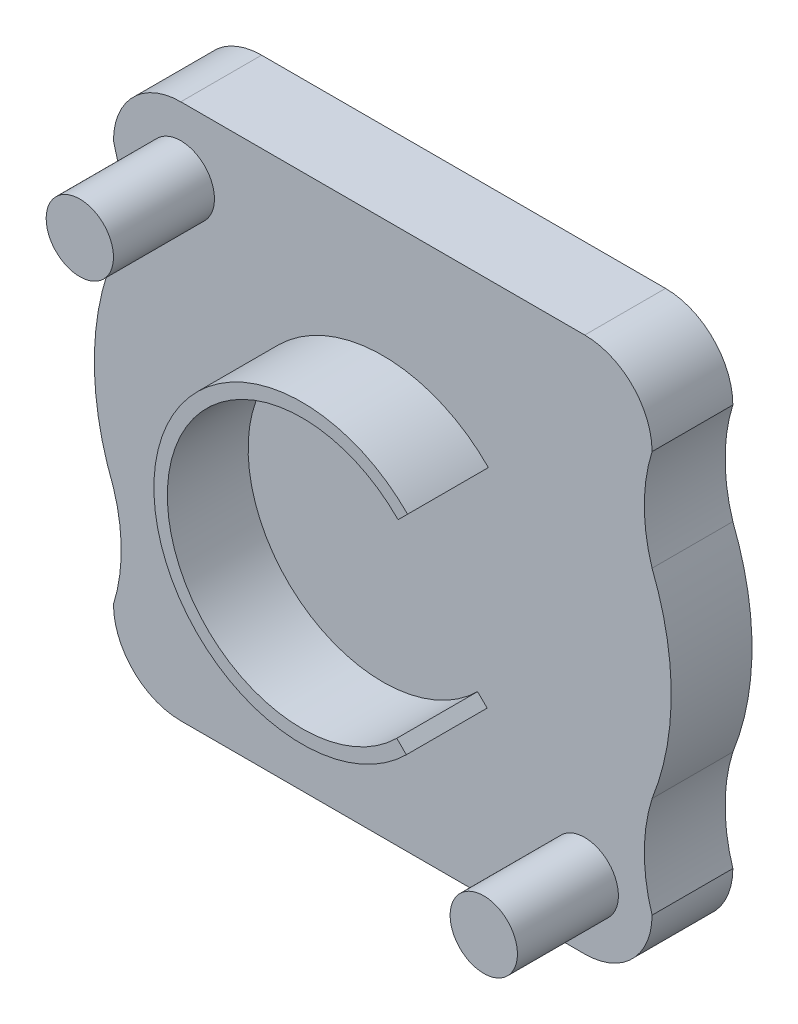
ISO-10303-21;
HEADER;
FILE_DESCRIPTION(('STEP AP214'),'2;1');
FILE_NAME('part.step','',(''),(''),'','','');
FILE_SCHEMA(('AUTOMOTIVE_DESIGN { 1 0 10303 214 1 1 1 1 }'));
ENDSEC;
DATA;
#1=APPLICATION_CONTEXT('core data for automotive mechanical design processes');
#2=APPLICATION_PROTOCOL_DEFINITION('international standard','automotive_design',2000,#1);
#3=PRODUCT_CONTEXT('',#1,'mechanical');
#4=PRODUCT('Part','Part','',(#3));
#5=PRODUCT_RELATED_PRODUCT_CATEGORY('part','',(#4));
#6=PRODUCT_DEFINITION_FORMATION('','',#4);
#7=PRODUCT_DEFINITION_CONTEXT('part definition',#1,'design');
#8=PRODUCT_DEFINITION('design','',#6,#7);
#9=PRODUCT_DEFINITION_SHAPE('','',#8);
#10=(LENGTH_UNIT() NAMED_UNIT(*) SI_UNIT(.MILLI.,.METRE.));
#11=(NAMED_UNIT(*) PLANE_ANGLE_UNIT() SI_UNIT($,.RADIAN.));
#12=(NAMED_UNIT(*) SI_UNIT($,.STERADIAN.) SOLID_ANGLE_UNIT());
#13=UNCERTAINTY_MEASURE_WITH_UNIT(LENGTH_MEASURE(1.E-05),#10,'distance_accuracy_value','');
#14=(GEOMETRIC_REPRESENTATION_CONTEXT(3) GLOBAL_UNCERTAINTY_ASSIGNED_CONTEXT((#13)) GLOBAL_UNIT_ASSIGNED_CONTEXT((#10,
#11,#12)) REPRESENTATION_CONTEXT('',''));
#15=CARTESIAN_POINT('',(0.,0.,0.));
#16=DIRECTION('',(0.,0.,1.));
#17=DIRECTION('',(1.,0.,0.));
#18=AXIS2_PLACEMENT_3D('',#15,#16,#17);
#19=CARTESIAN_POINT('',(16.2175139289976,5.62133263666804,0.));
#20=DIRECTION('',(0.,0.,1.));
#21=DIRECTION('',(1.,0.,0.));
#22=AXIS2_PLACEMENT_3D('',#19,#20,#21);
#23=PLANE('',#22);
#24=CARTESIAN_POINT('',(7.62,-7.62,0.));
#25=DIRECTION('',(0.,0.,1.));
#26=DIRECTION('',(1.,0.,0.));
#27=AXIS2_PLACEMENT_3D('',#24,#25,#26);
#28=CIRCLE('',#27,1.27);
#29=CARTESIAN_POINT('',(6.35,-7.62,0.));
#30=VERTEX_POINT('',#29);
#31=EDGE_CURVE('E295',#30,#30,#28,.T.);
#32=ORIENTED_EDGE('',*,*,#31,.F.);
#33=EDGE_LOOP('',(#32));
#34=FACE_BOUND('',#33,.T.);
#35=CARTESIAN_POINT('',(-7.62000000000001,7.52633263666802,0.));
#36=DIRECTION('',(0.,0.,1.));
#37=DIRECTION('',(1.,0.,0.));
#38=AXIS2_PLACEMENT_3D('',#35,#36,#37);
#39=CIRCLE('',#38,1.27);
#40=CARTESIAN_POINT('',(-8.89000000000001,7.52633263666802,0.));
#41=VERTEX_POINT('',#40);
#42=EDGE_CURVE('E294',#41,#41,#39,.T.);
#43=ORIENTED_EDGE('',*,*,#42,.F.);
#44=EDGE_LOOP('',(#43));
#45=FACE_BOUND('',#44,.T.);
#46=CARTESIAN_POINT('',(16.2175139289976,5.62133263666804,0.));
#47=DIRECTION('',(0.,0.,-1.));
#48=DIRECTION('',(1.,0.,0.));
#49=AXIS2_PLACEMENT_3D('',#46,#47,#48);
#50=CIRCLE('',#49,6.34999999999999);
#51=CARTESIAN_POINT('',(10.16,3.71633263666804,0.));
#52=VERTEX_POINT('',#51);
#53=CARTESIAN_POINT('',(10.16,7.52633263666802,0.));
#54=VERTEX_POINT('',#53);
#55=EDGE_CURVE('E183',#52,#54,#50,.T.);
#56=ORIENTED_EDGE('',*,*,#55,.T.);
#57=CARTESIAN_POINT('',(7.62,7.52633263666802,0.));
#58=DIRECTION('',(0.,0.,1.));
#59=DIRECTION('',(1.,0.,0.));
#60=AXIS2_PLACEMENT_3D('',#57,#58,#59);
#61=CIRCLE('',#60,2.54);
#62=CARTESIAN_POINT('',(7.62,10.066332636668,0.));
#63=VERTEX_POINT('',#62);
#64=EDGE_CURVE('E186',#54,#63,#61,.T.);
#65=ORIENTED_EDGE('',*,*,#64,.T.);
#66=DIRECTION('',(-1.,0.,0.));
#67=VECTOR('',#66,1.);
#68=CARTESIAN_POINT('',(-7.62000000000001,10.066332636668,0.));
#69=LINE('',#68,#67);
#70=CARTESIAN_POINT('',(-7.62000000000001,10.066332636668,0.));
#71=VERTEX_POINT('',#70);
#72=EDGE_CURVE('E190',#63,#71,#69,.T.);
#73=ORIENTED_EDGE('',*,*,#72,.T.);
#74=CARTESIAN_POINT('',(-7.62000000000001,7.52633263666802,0.));
#75=DIRECTION('',(0.,0.,1.));
#76=DIRECTION('',(-1.,0.,0.));
#77=AXIS2_PLACEMENT_3D('',#74,#75,#76);
#78=CIRCLE('',#77,2.54);
#79=CARTESIAN_POINT('',(-10.16,7.52633263666802,0.));
#80=VERTEX_POINT('',#79);
#81=EDGE_CURVE('E193',#71,#80,#78,.T.);
#82=ORIENTED_EDGE('',*,*,#81,.T.);
#83=CARTESIAN_POINT('',(-16.2175139289976,5.62133263666803,0.));
#84=DIRECTION('',(0.,0.,-1.));
#85=DIRECTION('',(-1.,0.,0.));
#86=AXIS2_PLACEMENT_3D('',#83,#84,#85);
#87=CIRCLE('',#86,6.35);
#88=CARTESIAN_POINT('',(-10.16,3.71633263666804,0.));
#89=VERTEX_POINT('',#88);
#90=EDGE_CURVE('E196',#80,#89,#87,.T.);
#91=ORIENTED_EDGE('',*,*,#90,.T.);
#92=CARTESIAN_POINT('',(-0.722617986933221,-0.0468336816659767,0.));
#93=DIRECTION('',(0.,0.,1.));
#94=DIRECTION('',(1.,0.,0.));
#95=AXIS2_PLACEMENT_3D('',#92,#93,#94);
#96=CIRCLE('',#95,10.16);
#97=CARTESIAN_POINT('',(-10.16,-3.81,0.));
#98=VERTEX_POINT('',#97);
#99=EDGE_CURVE('E199',#89,#98,#96,.T.);
#100=ORIENTED_EDGE('',*,*,#99,.T.);
#101=CARTESIAN_POINT('',(-16.2175139289976,-5.71499999999999,0.));
#102=DIRECTION('',(0.,0.,-1.));
#103=DIRECTION('',(1.,0.,0.));
#104=AXIS2_PLACEMENT_3D('',#101,#102,#103);
#105=CIRCLE('',#104,6.35);
#106=CARTESIAN_POINT('',(-10.16,-7.61999999999998,0.));
#107=VERTEX_POINT('',#106);
#108=EDGE_CURVE('E202',#98,#107,#105,.T.);
#109=ORIENTED_EDGE('',*,*,#108,.T.);
#110=CARTESIAN_POINT('',(-7.62,-7.62,0.));
#111=DIRECTION('',(0.,0.,1.));
#112=DIRECTION('',(-1.,0.,0.));
#113=AXIS2_PLACEMENT_3D('',#110,#111,#112);
#114=CIRCLE('',#113,2.54);
#115=CARTESIAN_POINT('',(-7.61999999999998,-10.16,0.));
#116=VERTEX_POINT('',#115);
#117=EDGE_CURVE('E205',#107,#116,#114,.T.);
#118=ORIENTED_EDGE('',*,*,#117,.T.);
#119=DIRECTION('',(1.,0.,0.));
#120=VECTOR('',#119,1.);
#121=CARTESIAN_POINT('',(0.,-10.16,0.));
#122=LINE('',#121,#120);
#123=CARTESIAN_POINT('',(7.61999999999998,-10.16,0.));
#124=VERTEX_POINT('',#123);
#125=EDGE_CURVE('E208',#116,#124,#122,.T.);
#126=ORIENTED_EDGE('',*,*,#125,.T.);
#127=CARTESIAN_POINT('',(7.62,-7.62,0.));
#128=DIRECTION('',(0.,0.,1.));
#129=DIRECTION('',(1.,0.,0.));
#130=AXIS2_PLACEMENT_3D('',#127,#128,#129);
#131=CIRCLE('',#130,2.54);
#132=CARTESIAN_POINT('',(10.16,-7.62,0.));
#133=VERTEX_POINT('',#132);
#134=EDGE_CURVE('E211',#124,#133,#131,.T.);
#135=ORIENTED_EDGE('',*,*,#134,.T.);
#136=CARTESIAN_POINT('',(16.2175139289976,-5.71499999999999,0.));
#137=DIRECTION('',(0.,0.,-1.));
#138=DIRECTION('',(-1.,0.,0.));
#139=AXIS2_PLACEMENT_3D('',#136,#137,#138);
#140=CIRCLE('',#139,6.35);
#141=CARTESIAN_POINT('',(10.16,-3.81,0.));
#142=VERTEX_POINT('',#141);
#143=EDGE_CURVE('E160',#133,#142,#140,.T.);
#144=ORIENTED_EDGE('',*,*,#143,.T.);
#145=CARTESIAN_POINT('',(0.72261798693322,-0.0468336816659767,0.));
#146=DIRECTION('',(0.,0.,1.));
#147=DIRECTION('',(-1.,0.,0.));
#148=AXIS2_PLACEMENT_3D('',#145,#146,#147);
#149=CIRCLE('',#148,10.16);
#150=EDGE_CURVE('E214',#142,#52,#149,.T.);
#151=ORIENTED_EDGE('',*,*,#150,.T.);
#152=EDGE_LOOP('',(#56,#65,#73,#82,#91,#100,#109,#118,#126,#135,#144,#151));
#153=FACE_BOUND('',#152,.T.);
#154=DIRECTION('',(-0.708867470916355,0.705341696397321,0.));
#155=VECTOR('',#154,1.);
#156=CARTESIAN_POINT('',(3.93766496937354,-3.964913440287,0.));
#157=LINE('',#156,#155);
#158=CARTESIAN_POINT('',(3.93766496937354,-3.964913440287,0.));
#159=VERTEX_POINT('',#158);
#160=CARTESIAN_POINT('',(3.57755330316845,-3.6065929023094,0.));
#161=VERTEX_POINT('',#160);
#162=EDGE_CURVE('E322',#159,#161,#157,.T.);
#163=ORIENTED_EDGE('',*,*,#162,.F.);
#164=CARTESIAN_POINT('',(0.,0.,0.));
#165=DIRECTION('',(0.,0.,1.));
#166=DIRECTION('',(1.,0.,0.));
#167=AXIS2_PLACEMENT_3D('',#164,#165,#166);
#168=CIRCLE('',#167,5.588);
#169=CARTESIAN_POINT('',(3.98449806884601,3.9178462373302,0.));
#170=VERTEX_POINT('',#169);
#171=EDGE_CURVE('E304',#170,#159,#168,.T.);
#172=ORIENTED_EDGE('',*,*,#171,.F.);
#173=DIRECTION('',(0.708867470916355,0.705341696397321,0.));
#174=VECTOR('',#173,1.);
#175=CARTESIAN_POINT('',(3.62438640264092,3.5595256993526,0.));
#176=LINE('',#175,#174);
#177=CARTESIAN_POINT('',(3.62438640264092,3.5595256993526,0.));
#178=VERTEX_POINT('',#177);
#179=EDGE_CURVE('E310',#178,#170,#176,.T.);
#180=ORIENTED_EDGE('',*,*,#179,.F.);
#181=CARTESIAN_POINT('',(0.,0.,0.));
#182=DIRECTION('',(0.,0.,-1.));
#183=DIRECTION('',(1.,0.,0.));
#184=AXIS2_PLACEMENT_3D('',#181,#182,#183);
#185=CIRCLE('',#184,5.08);
#186=EDGE_CURVE('E325',#161,#178,#185,.T.);
#187=ORIENTED_EDGE('',*,*,#186,.F.);
#188=EDGE_LOOP('',(#163,#172,#180,#187));
#189=FACE_BOUND('',#188,.T.);
#190=ADVANCED_FACE('F48',(#34,#45,#153,#189),#23,.T.);
#191=CARTESIAN_POINT('',(16.2175139289976,5.62133263666804,-3.048));
#192=DIRECTION('',(0.,0.,1.));
#193=DIRECTION('',(1.,0.,0.));
#194=AXIS2_PLACEMENT_3D('',#191,#192,#193);
#195=CYLINDRICAL_SURFACE('',#194,6.34999999999999);
#196=ORIENTED_EDGE('',*,*,#55,.F.);
#197=DIRECTION('',(0.,0.,1.));
#198=VECTOR('',#197,1.);
#199=CARTESIAN_POINT('',(10.16,3.71633263666804,-3.048));
#200=LINE('',#199,#198);
#201=CARTESIAN_POINT('',(10.16,3.71633263666804,-3.048));
#202=VERTEX_POINT('',#201);
#203=EDGE_CURVE('E13',#202,#52,#200,.T.);
#204=ORIENTED_EDGE('',*,*,#203,.F.);
#205=CARTESIAN_POINT('',(16.2175139289976,5.62133263666804,-3.048));
#206=DIRECTION('',(0.,0.,-1.));
#207=DIRECTION('',(1.,0.,0.));
#208=AXIS2_PLACEMENT_3D('',#205,#206,#207);
#209=CIRCLE('',#208,6.34999999999999);
#210=CARTESIAN_POINT('',(10.16,7.52633263666802,-3.048));
#211=VERTEX_POINT('',#210);
#212=EDGE_CURVE('E216',#202,#211,#209,.T.);
#213=ORIENTED_EDGE('',*,*,#212,.T.);
#214=DIRECTION('',(0.,0.,1.));
#215=VECTOR('',#214,1.);
#216=CARTESIAN_POINT('',(10.16,7.52633263666802,-3.048));
#217=LINE('',#216,#215);
#218=EDGE_CURVE('E52',#211,#54,#217,.T.);
#219=ORIENTED_EDGE('',*,*,#218,.T.);
#220=EDGE_LOOP('',(#196,#204,#213,#219));
#221=FACE_BOUND('',#220,.T.);
#222=ADVANCED_FACE('F50',(#221),#195,.F.);
#223=CARTESIAN_POINT('',(0.72261798693322,-0.0468336816659767,-3.048));
#224=DIRECTION('',(0.,0.,1.));
#225=DIRECTION('',(1.,0.,0.));
#226=AXIS2_PLACEMENT_3D('',#223,#224,#225);
#227=CYLINDRICAL_SURFACE('',#226,10.16);
#228=ORIENTED_EDGE('',*,*,#150,.F.);
#229=DIRECTION('',(0.,0.,1.));
#230=VECTOR('',#229,1.);
#231=CARTESIAN_POINT('',(10.16,-3.81,-3.048));
#232=LINE('',#231,#230);
#233=CARTESIAN_POINT('',(10.16,-3.81,-3.048));
#234=VERTEX_POINT('',#233);
#235=EDGE_CURVE('E57',#234,#142,#232,.T.);
#236=ORIENTED_EDGE('',*,*,#235,.F.);
#237=CARTESIAN_POINT('',(0.72261798693322,-0.0468336816659767,-3.048));
#238=DIRECTION('',(0.,0.,1.));
#239=DIRECTION('',(-1.,0.,0.));
#240=AXIS2_PLACEMENT_3D('',#237,#238,#239);
#241=CIRCLE('',#240,10.16);
#242=EDGE_CURVE('E172',#234,#202,#241,.T.);
#243=ORIENTED_EDGE('',*,*,#242,.T.);
#244=ORIENTED_EDGE('',*,*,#203,.T.);
#245=EDGE_LOOP('',(#228,#236,#243,#244));
#246=FACE_BOUND('',#245,.T.);
#247=ADVANCED_FACE('F237',(#246),#227,.T.);
#248=CARTESIAN_POINT('',(16.2175139289976,-5.71499999999999,-3.048));
#249=DIRECTION('',(0.,0.,1.));
#250=DIRECTION('',(1.,0.,0.));
#251=AXIS2_PLACEMENT_3D('',#248,#249,#250);
#252=CYLINDRICAL_SURFACE('',#251,6.35);
#253=ORIENTED_EDGE('',*,*,#143,.F.);
#254=DIRECTION('',(0.,0.,1.));
#255=VECTOR('',#254,1.);
#256=CARTESIAN_POINT('',(10.16,-7.62,-3.048));
#257=LINE('',#256,#255);
#258=CARTESIAN_POINT('',(10.16,-7.62,-3.048));
#259=VERTEX_POINT('',#258);
#260=EDGE_CURVE('E154',#259,#133,#257,.T.);
#261=ORIENTED_EDGE('',*,*,#260,.F.);
#262=CARTESIAN_POINT('',(16.2175139289976,-5.71499999999999,-3.048));
#263=DIRECTION('',(0.,0.,-1.));
#264=DIRECTION('',(-1.,0.,0.));
#265=AXIS2_PLACEMENT_3D('',#262,#263,#264);
#266=CIRCLE('',#265,6.35);
#267=EDGE_CURVE('E157',#259,#234,#266,.T.);
#268=ORIENTED_EDGE('',*,*,#267,.T.);
#269=ORIENTED_EDGE('',*,*,#235,.T.);
#270=EDGE_LOOP('',(#253,#261,#268,#269));
#271=FACE_BOUND('',#270,.T.);
#272=ADVANCED_FACE('F156',(#271),#252,.F.);
#273=CARTESIAN_POINT('',(7.62,-7.62,-3.048));
#274=DIRECTION('',(0.,0.,1.));
#275=DIRECTION('',(1.,0.,0.));
#276=AXIS2_PLACEMENT_3D('',#273,#274,#275);
#277=CYLINDRICAL_SURFACE('',#276,2.54);
#278=ORIENTED_EDGE('',*,*,#134,.F.);
#279=DIRECTION('',(0.,0.,1.));
#280=VECTOR('',#279,1.);
#281=CARTESIAN_POINT('',(7.61999999999998,-10.16,-3.048));
#282=LINE('',#281,#280);
#283=CARTESIAN_POINT('',(7.61999999999998,-10.16,-3.048));
#284=VERTEX_POINT('',#283);
#285=EDGE_CURVE('E165',#284,#124,#282,.T.);
#286=ORIENTED_EDGE('',*,*,#285,.F.);
#287=CARTESIAN_POINT('',(7.62,-7.62,-3.048));
#288=DIRECTION('',(0.,0.,1.));
#289=DIRECTION('',(1.,0.,0.));
#290=AXIS2_PLACEMENT_3D('',#287,#288,#289);
#291=CIRCLE('',#290,2.54);
#292=EDGE_CURVE('E171',#284,#259,#291,.T.);
#293=ORIENTED_EDGE('',*,*,#292,.T.);
#294=ORIENTED_EDGE('',*,*,#260,.T.);
#295=EDGE_LOOP('',(#278,#286,#293,#294));
#296=FACE_BOUND('',#295,.T.);
#297=ADVANCED_FACE('F175',(#296),#277,.T.);
#298=CARTESIAN_POINT('',(0.,-10.16,-3.048));
#299=DIRECTION('',(0.,-1.,0.));
#300=DIRECTION('',(0.,0.,-1.));
#301=AXIS2_PLACEMENT_3D('',#298,#299,#300);
#302=PLANE('',#301);
#303=ORIENTED_EDGE('',*,*,#125,.F.);
#304=DIRECTION('',(0.,0.,1.));
#305=VECTOR('',#304,1.);
#306=CARTESIAN_POINT('',(-7.61999999999998,-10.16,-3.048));
#307=LINE('',#306,#305);
#308=CARTESIAN_POINT('',(-7.61999999999998,-10.16,-3.048));
#309=VERTEX_POINT('',#308);
#310=EDGE_CURVE('E220',#309,#116,#307,.T.);
#311=ORIENTED_EDGE('',*,*,#310,.F.);
#312=DIRECTION('',(1.,0.,0.));
#313=VECTOR('',#312,1.);
#314=CARTESIAN_POINT('',(0.,-10.16,-3.048));
#315=LINE('',#314,#313);
#316=EDGE_CURVE('E176',#309,#284,#315,.T.);
#317=ORIENTED_EDGE('',*,*,#316,.T.);
#318=ORIENTED_EDGE('',*,*,#285,.T.);
#319=EDGE_LOOP('',(#303,#311,#317,#318));
#320=FACE_BOUND('',#319,.T.);
#321=ADVANCED_FACE('F378',(#320),#302,.T.);
#322=CARTESIAN_POINT('',(-7.62,-7.62,-3.048));
#323=DIRECTION('',(0.,0.,1.));
#324=DIRECTION('',(1.,0.,0.));
#325=AXIS2_PLACEMENT_3D('',#322,#323,#324);
#326=CYLINDRICAL_SURFACE('',#325,2.54);
#327=ORIENTED_EDGE('',*,*,#117,.F.);
#328=DIRECTION('',(0.,0.,1.));
#329=VECTOR('',#328,1.);
#330=CARTESIAN_POINT('',(-10.16,-7.61999999999998,-3.048));
#331=LINE('',#330,#329);
#332=CARTESIAN_POINT('',(-10.16,-7.61999999999998,-3.048));
#333=VERTEX_POINT('',#332);
#334=EDGE_CURVE('E223',#333,#107,#331,.T.);
#335=ORIENTED_EDGE('',*,*,#334,.F.);
#336=CARTESIAN_POINT('',(-7.62,-7.62,-3.048));
#337=DIRECTION('',(0.,0.,1.));
#338=DIRECTION('',(-1.,0.,0.));
#339=AXIS2_PLACEMENT_3D('',#336,#337,#338);
#340=CIRCLE('',#339,2.54);
#341=EDGE_CURVE('E178',#333,#309,#340,.T.);
#342=ORIENTED_EDGE('',*,*,#341,.T.);
#343=ORIENTED_EDGE('',*,*,#310,.T.);
#344=EDGE_LOOP('',(#327,#335,#342,#343));
#345=FACE_BOUND('',#344,.T.);
#346=ADVANCED_FACE('F357',(#345),#326,.T.);
#347=CARTESIAN_POINT('',(-16.2175139289976,-5.71499999999999,-3.048));
#348=DIRECTION('',(0.,0.,1.));
#349=DIRECTION('',(1.,0.,0.));
#350=AXIS2_PLACEMENT_3D('',#347,#348,#349);
#351=CYLINDRICAL_SURFACE('',#350,6.35);
#352=ORIENTED_EDGE('',*,*,#108,.F.);
#353=DIRECTION('',(0.,0.,1.));
#354=VECTOR('',#353,1.);
#355=CARTESIAN_POINT('',(-10.16,-3.81,-3.048));
#356=LINE('',#355,#354);
#357=CARTESIAN_POINT('',(-10.16,-3.81,-3.048));
#358=VERTEX_POINT('',#357);
#359=EDGE_CURVE('E225',#358,#98,#356,.T.);
#360=ORIENTED_EDGE('',*,*,#359,.F.);
#361=CARTESIAN_POINT('',(-16.2175139289976,-5.71499999999999,-3.048));
#362=DIRECTION('',(0.,0.,-1.));
#363=DIRECTION('',(1.,0.,0.));
#364=AXIS2_PLACEMENT_3D('',#361,#362,#363);
#365=CIRCLE('',#364,6.35);
#366=EDGE_CURVE('E351',#358,#333,#365,.T.);
#367=ORIENTED_EDGE('',*,*,#366,.T.);
#368=ORIENTED_EDGE('',*,*,#334,.T.);
#369=EDGE_LOOP('',(#352,#360,#367,#368));
#370=FACE_BOUND('',#369,.T.);
#371=ADVANCED_FACE('F362',(#370),#351,.F.);
#372=CARTESIAN_POINT('',(-0.722617986933221,-0.0468336816659767,-3.048));
#373=DIRECTION('',(0.,0.,1.));
#374=DIRECTION('',(1.,0.,0.));
#375=AXIS2_PLACEMENT_3D('',#372,#373,#374);
#376=CYLINDRICAL_SURFACE('',#375,10.16);
#377=ORIENTED_EDGE('',*,*,#99,.F.);
#378=DIRECTION('',(0.,0.,1.));
#379=VECTOR('',#378,1.);
#380=CARTESIAN_POINT('',(-10.16,3.71633263666804,-3.048));
#381=LINE('',#380,#379);
#382=CARTESIAN_POINT('',(-10.16,3.71633263666804,-3.048));
#383=VERTEX_POINT('',#382);
#384=EDGE_CURVE('E227',#383,#89,#381,.T.);
#385=ORIENTED_EDGE('',*,*,#384,.F.);
#386=CARTESIAN_POINT('',(-0.722617986933221,-0.0468336816659767,-3.048));
#387=DIRECTION('',(0.,0.,1.));
#388=DIRECTION('',(1.,0.,0.));
#389=AXIS2_PLACEMENT_3D('',#386,#387,#388);
#390=CIRCLE('',#389,10.16);
#391=EDGE_CURVE('E348',#383,#358,#390,.T.);
#392=ORIENTED_EDGE('',*,*,#391,.T.);
#393=ORIENTED_EDGE('',*,*,#359,.T.);
#394=EDGE_LOOP('',(#377,#385,#392,#393));
#395=FACE_BOUND('',#394,.T.);
#396=ADVANCED_FACE('F365',(#395),#376,.T.);
#397=CARTESIAN_POINT('',(-16.2175139289976,5.62133263666803,-3.048));
#398=DIRECTION('',(0.,0.,1.));
#399=DIRECTION('',(1.,0.,0.));
#400=AXIS2_PLACEMENT_3D('',#397,#398,#399);
#401=CYLINDRICAL_SURFACE('',#400,6.35);
#402=ORIENTED_EDGE('',*,*,#90,.F.);
#403=DIRECTION('',(0.,0.,1.));
#404=VECTOR('',#403,1.);
#405=CARTESIAN_POINT('',(-10.16,7.52633263666802,-3.048));
#406=LINE('',#405,#404);
#407=CARTESIAN_POINT('',(-10.16,7.52633263666802,-3.048));
#408=VERTEX_POINT('',#407);
#409=EDGE_CURVE('E229',#408,#80,#406,.T.);
#410=ORIENTED_EDGE('',*,*,#409,.F.);
#411=CARTESIAN_POINT('',(-16.2175139289976,5.62133263666803,-3.048));
#412=DIRECTION('',(0.,0.,-1.));
#413=DIRECTION('',(-1.,0.,0.));
#414=AXIS2_PLACEMENT_3D('',#411,#412,#413);
#415=CIRCLE('',#414,6.35);
#416=EDGE_CURVE('E345',#408,#383,#415,.T.);
#417=ORIENTED_EDGE('',*,*,#416,.T.);
#418=ORIENTED_EDGE('',*,*,#384,.T.);
#419=EDGE_LOOP('',(#402,#410,#417,#418));
#420=FACE_BOUND('',#419,.T.);
#421=ADVANCED_FACE('F370',(#420),#401,.F.);
#422=CARTESIAN_POINT('',(-7.62000000000001,7.52633263666802,-3.048));
#423=DIRECTION('',(0.,0.,1.));
#424=DIRECTION('',(1.,0.,0.));
#425=AXIS2_PLACEMENT_3D('',#422,#423,#424);
#426=CYLINDRICAL_SURFACE('',#425,2.54);
#427=ORIENTED_EDGE('',*,*,#81,.F.);
#428=DIRECTION('',(0.,0.,1.));
#429=VECTOR('',#428,1.);
#430=CARTESIAN_POINT('',(-7.62000000000001,10.066332636668,-3.048));
#431=LINE('',#430,#429);
#432=CARTESIAN_POINT('',(-7.62000000000001,10.066332636668,-3.048));
#433=VERTEX_POINT('',#432);
#434=EDGE_CURVE('E231',#433,#71,#431,.T.);
#435=ORIENTED_EDGE('',*,*,#434,.F.);
#436=CARTESIAN_POINT('',(-7.62000000000001,7.52633263666802,-3.048));
#437=DIRECTION('',(0.,0.,1.));
#438=DIRECTION('',(-1.,0.,0.));
#439=AXIS2_PLACEMENT_3D('',#436,#437,#438);
#440=CIRCLE('',#439,2.54);
#441=EDGE_CURVE('E342',#433,#408,#440,.T.);
#442=ORIENTED_EDGE('',*,*,#441,.T.);
#443=ORIENTED_EDGE('',*,*,#409,.T.);
#444=EDGE_LOOP('',(#427,#435,#442,#443));
#445=FACE_BOUND('',#444,.T.);
#446=ADVANCED_FACE('F373',(#445),#426,.T.);
#447=CARTESIAN_POINT('',(-7.62000000000001,10.066332636668,-3.048));
#448=DIRECTION('',(0.,1.,0.));
#449=DIRECTION('',(0.,0.,1.));
#450=AXIS2_PLACEMENT_3D('',#447,#448,#449);
#451=PLANE('',#450);
#452=ORIENTED_EDGE('',*,*,#72,.F.);
#453=DIRECTION('',(0.,0.,1.));
#454=VECTOR('',#453,1.);
#455=CARTESIAN_POINT('',(7.62,10.066332636668,-3.048));
#456=LINE('',#455,#454);
#457=CARTESIAN_POINT('',(7.62,10.066332636668,-3.048));
#458=VERTEX_POINT('',#457);
#459=EDGE_CURVE('E232',#458,#63,#456,.T.);
#460=ORIENTED_EDGE('',*,*,#459,.F.);
#461=DIRECTION('',(-1.,0.,0.));
#462=VECTOR('',#461,1.);
#463=CARTESIAN_POINT('',(-7.62000000000001,10.066332636668,-3.048));
#464=LINE('',#463,#462);
#465=EDGE_CURVE('E339',#458,#433,#464,.T.);
#466=ORIENTED_EDGE('',*,*,#465,.T.);
#467=ORIENTED_EDGE('',*,*,#434,.T.);
#468=EDGE_LOOP('',(#452,#460,#466,#467));
#469=FACE_BOUND('',#468,.T.);
#470=ADVANCED_FACE('F376',(#469),#451,.T.);
#471=CARTESIAN_POINT('',(7.62,7.52633263666802,-3.048));
#472=DIRECTION('',(0.,0.,1.));
#473=DIRECTION('',(1.,0.,0.));
#474=AXIS2_PLACEMENT_3D('',#471,#472,#473);
#475=CYLINDRICAL_SURFACE('',#474,2.54);
#476=ORIENTED_EDGE('',*,*,#64,.F.);
#477=ORIENTED_EDGE('',*,*,#218,.F.);
#478=CARTESIAN_POINT('',(7.62,7.52633263666802,-3.048));
#479=DIRECTION('',(0.,0.,1.));
#480=DIRECTION('',(1.,0.,0.));
#481=AXIS2_PLACEMENT_3D('',#478,#479,#480);
#482=CIRCLE('',#481,2.54);
#483=EDGE_CURVE('E337',#211,#458,#482,.T.);
#484=ORIENTED_EDGE('',*,*,#483,.T.);
#485=ORIENTED_EDGE('',*,*,#459,.T.);
#486=EDGE_LOOP('',(#476,#477,#484,#485));
#487=FACE_BOUND('',#486,.T.);
#488=ADVANCED_FACE('F234',(#487),#475,.T.);
#489=CARTESIAN_POINT('',(16.2175139289976,5.62133263666804,-3.048));
#490=DIRECTION('',(0.,0.,1.));
#491=DIRECTION('',(1.,0.,0.));
#492=AXIS2_PLACEMENT_3D('',#489,#490,#491);
#493=PLANE('',#492);
#494=ORIENTED_EDGE('',*,*,#212,.F.);
#495=ORIENTED_EDGE('',*,*,#242,.F.);
#496=ORIENTED_EDGE('',*,*,#267,.F.);
#497=ORIENTED_EDGE('',*,*,#292,.F.);
#498=ORIENTED_EDGE('',*,*,#316,.F.);
#499=ORIENTED_EDGE('',*,*,#341,.F.);
#500=ORIENTED_EDGE('',*,*,#366,.F.);
#501=ORIENTED_EDGE('',*,*,#391,.F.);
#502=ORIENTED_EDGE('',*,*,#416,.F.);
#503=ORIENTED_EDGE('',*,*,#441,.F.);
#504=ORIENTED_EDGE('',*,*,#465,.F.);
#505=ORIENTED_EDGE('',*,*,#483,.F.);
#506=EDGE_LOOP('',(#494,#495,#496,#497,#498,#499,#500,#501,#502,#503,#504,#505));
#507=FACE_BOUND('',#506,.T.);
#508=ADVANCED_FACE('F169',(#507),#493,.F.);
#509=CARTESIAN_POINT('',(0.,0.,3.048));
#510=DIRECTION('',(0.,0.,-1.));
#511=DIRECTION('',(-1.,0.,0.));
#512=AXIS2_PLACEMENT_3D('',#509,#510,#511);
#513=CYLINDRICAL_SURFACE('',#512,5.588);
#514=ORIENTED_EDGE('',*,*,#171,.T.);
#515=DIRECTION('',(0.,0.,-1.));
#516=VECTOR('',#515,1.);
#517=CARTESIAN_POINT('',(3.93766496937354,-3.964913440287,3.048));
#518=LINE('',#517,#516);
#519=CARTESIAN_POINT('',(3.93766496937354,-3.964913440287,3.048));
#520=VERTEX_POINT('',#519);
#521=EDGE_CURVE('E187',#520,#159,#518,.T.);
#522=ORIENTED_EDGE('',*,*,#521,.F.);
#523=CARTESIAN_POINT('',(0.,0.,3.048));
#524=DIRECTION('',(0.,0.,1.));
#525=DIRECTION('',(1.,0.,0.));
#526=AXIS2_PLACEMENT_3D('',#523,#524,#525);
#527=CIRCLE('',#526,5.588);
#528=CARTESIAN_POINT('',(3.98449806884601,3.9178462373302,3.048));
#529=VERTEX_POINT('',#528);
#530=EDGE_CURVE('E306',#529,#520,#527,.T.);
#531=ORIENTED_EDGE('',*,*,#530,.F.);
#532=DIRECTION('',(0.,0.,-1.));
#533=VECTOR('',#532,1.);
#534=CARTESIAN_POINT('',(3.98449806884601,3.9178462373302,3.048));
#535=LINE('',#534,#533);
#536=EDGE_CURVE('E319',#529,#170,#535,.T.);
#537=ORIENTED_EDGE('',*,*,#536,.T.);
#538=EDGE_LOOP('',(#514,#522,#531,#537));
#539=FACE_BOUND('',#538,.T.);
#540=ADVANCED_FACE('F255',(#539),#513,.T.);
#541=CARTESIAN_POINT('',(3.93766496937354,-3.964913440287,3.048));
#542=DIRECTION('',(-0.705341696397321,-0.708867470916355,0.));
#543=DIRECTION('',(0.708867470916355,-0.705341696397321,0.));
#544=AXIS2_PLACEMENT_3D('',#541,#542,#543);
#545=PLANE('',#544);
#546=ORIENTED_EDGE('',*,*,#162,.T.);
#547=DIRECTION('',(0.,0.,-1.));
#548=VECTOR('',#547,1.);
#549=CARTESIAN_POINT('',(3.57755330316845,-3.6065929023094,3.048));
#550=LINE('',#549,#548);
#551=CARTESIAN_POINT('',(3.57755330316845,-3.6065929023094,3.048));
#552=VERTEX_POINT('',#551);
#553=EDGE_CURVE('E331',#552,#161,#550,.T.);
#554=ORIENTED_EDGE('',*,*,#553,.F.);
#555=DIRECTION('',(-0.708867470916355,0.705341696397321,0.));
#556=VECTOR('',#555,1.);
#557=CARTESIAN_POINT('',(3.93766496937354,-3.964913440287,3.048));
#558=LINE('',#557,#556);
#559=EDGE_CURVE('E309',#520,#552,#558,.T.);
#560=ORIENTED_EDGE('',*,*,#559,.F.);
#561=ORIENTED_EDGE('',*,*,#521,.T.);
#562=EDGE_LOOP('',(#546,#554,#560,#561));
#563=FACE_BOUND('',#562,.T.);
#564=ADVANCED_FACE('F258',(#563),#545,.F.);
#565=CARTESIAN_POINT('',(0.,0.,3.048));
#566=DIRECTION('',(0.,0.,-1.));
#567=DIRECTION('',(-1.,0.,0.));
#568=AXIS2_PLACEMENT_3D('',#565,#566,#567);
#569=CYLINDRICAL_SURFACE('',#568,5.08);
#570=ORIENTED_EDGE('',*,*,#186,.T.);
#571=DIRECTION('',(0.,0.,-1.));
#572=VECTOR('',#571,1.);
#573=CARTESIAN_POINT('',(3.62438640264092,3.5595256993526,3.048));
#574=LINE('',#573,#572);
#575=CARTESIAN_POINT('',(3.62438640264092,3.5595256993526,3.048));
#576=VERTEX_POINT('',#575);
#577=EDGE_CURVE('E65',#576,#178,#574,.T.);
#578=ORIENTED_EDGE('',*,*,#577,.F.);
#579=CARTESIAN_POINT('',(0.,0.,3.048));
#580=DIRECTION('',(0.,0.,-1.));
#581=DIRECTION('',(1.,0.,0.));
#582=AXIS2_PLACEMENT_3D('',#579,#580,#581);
#583=CIRCLE('',#582,5.08);
#584=EDGE_CURVE('E313',#552,#576,#583,.T.);
#585=ORIENTED_EDGE('',*,*,#584,.F.);
#586=ORIENTED_EDGE('',*,*,#553,.T.);
#587=EDGE_LOOP('',(#570,#578,#585,#586));
#588=FACE_BOUND('',#587,.T.);
#589=ADVANCED_FACE('F262',(#588),#569,.F.);
#590=CARTESIAN_POINT('',(3.62438640264092,3.5595256993526,3.048));
#591=DIRECTION('',(-0.705341696397321,0.708867470916355,0.));
#592=DIRECTION('',(-0.708867470916355,-0.705341696397321,0.));
#593=AXIS2_PLACEMENT_3D('',#590,#591,#592);
#594=PLANE('',#593);
#595=ORIENTED_EDGE('',*,*,#179,.T.);
#596=ORIENTED_EDGE('',*,*,#536,.F.);
#597=DIRECTION('',(0.708867470916355,0.705341696397321,0.));
#598=VECTOR('',#597,1.);
#599=CARTESIAN_POINT('',(3.62438640264092,3.5595256993526,3.048));
#600=LINE('',#599,#598);
#601=EDGE_CURVE('E316',#576,#529,#600,.T.);
#602=ORIENTED_EDGE('',*,*,#601,.F.);
#603=ORIENTED_EDGE('',*,*,#577,.T.);
#604=EDGE_LOOP('',(#595,#596,#602,#603));
#605=FACE_BOUND('',#604,.T.);
#606=ADVANCED_FACE('F266',(#605),#594,.F.);
#607=CARTESIAN_POINT('',(0.,0.,3.048));
#608=DIRECTION('',(0.,0.,1.));
#609=DIRECTION('',(1.,0.,0.));
#610=AXIS2_PLACEMENT_3D('',#607,#608,#609);
#611=PLANE('',#610);
#612=ORIENTED_EDGE('',*,*,#530,.T.);
#613=ORIENTED_EDGE('',*,*,#559,.T.);
#614=ORIENTED_EDGE('',*,*,#584,.T.);
#615=ORIENTED_EDGE('',*,*,#601,.T.);
#616=EDGE_LOOP('',(#612,#613,#614,#615));
#617=FACE_BOUND('',#616,.T.);
#618=ADVANCED_FACE('F270',(#617),#611,.T.);
#619=CARTESIAN_POINT('',(-7.62000000000001,7.52633263666802,3.81));
#620=DIRECTION('',(0.,0.,-1.));
#621=DIRECTION('',(-1.,0.,0.));
#622=AXIS2_PLACEMENT_3D('',#619,#620,#621);
#623=CYLINDRICAL_SURFACE('',#622,1.27);
#624=CARTESIAN_POINT('',(-7.62000000000001,7.52633263666802,3.81));
#625=DIRECTION('',(0.,0.,1.));
#626=DIRECTION('',(1.,0.,0.));
#627=AXIS2_PLACEMENT_3D('',#624,#625,#626);
#628=CIRCLE('',#627,1.27);
#629=CARTESIAN_POINT('',(-8.89000000000001,7.52633263666802,3.81));
#630=VERTEX_POINT('',#629);
#631=EDGE_CURVE('E298',#630,#630,#628,.T.);
#632=CARTESIAN_POINT('',(-8.89000000000001,7.52633263666802,3.81));
#633=CARTESIAN_POINT('',(-8.89000000000001,7.52633263666802,3.7703125));
#634=CARTESIAN_POINT('',(-8.89000000000001,7.52633263666802,3.730625));
#635=CARTESIAN_POINT('',(-8.89000000000001,7.52633263666802,3.65125));
#636=CARTESIAN_POINT('',(-8.89000000000001,7.52633263666802,3.6115625));
#637=CARTESIAN_POINT('',(-8.89000000000001,7.52633263666802,3.5321875));
#638=CARTESIAN_POINT('',(-8.89000000000001,7.52633263666802,3.4925));
#639=CARTESIAN_POINT('',(-8.89000000000001,7.52633263666802,3.413125));
#640=CARTESIAN_POINT('',(-8.89000000000001,7.52633263666802,3.3734375));
#641=CARTESIAN_POINT('',(-8.89000000000001,7.52633263666802,3.2940625));
#642=CARTESIAN_POINT('',(-8.89000000000001,7.52633263666802,3.254375));
#643=CARTESIAN_POINT('',(-8.89000000000001,7.52633263666802,3.175));
#644=CARTESIAN_POINT('',(-8.89000000000001,7.52633263666802,3.1353125));
#645=CARTESIAN_POINT('',(-8.89000000000001,7.52633263666802,3.0559375));
#646=CARTESIAN_POINT('',(-8.89000000000001,7.52633263666802,3.01625));
#647=CARTESIAN_POINT('',(-8.89000000000001,7.52633263666802,2.936875));
#648=CARTESIAN_POINT('',(-8.89000000000001,7.52633263666802,2.8971875));
#649=CARTESIAN_POINT('',(-8.89000000000001,7.52633263666802,2.8178125));
#650=CARTESIAN_POINT('',(-8.89000000000001,7.52633263666802,2.778125));
#651=CARTESIAN_POINT('',(-8.89000000000001,7.52633263666802,2.69875));
#652=CARTESIAN_POINT('',(-8.89000000000001,7.52633263666802,2.6590625));
#653=CARTESIAN_POINT('',(-8.89000000000001,7.52633263666802,2.5796875));
#654=CARTESIAN_POINT('',(-8.89000000000001,7.52633263666802,2.54));
#655=CARTESIAN_POINT('',(-8.89000000000001,7.52633263666802,2.460625));
#656=CARTESIAN_POINT('',(-8.89000000000001,7.52633263666802,2.4209375));
#657=CARTESIAN_POINT('',(-8.89000000000001,7.52633263666802,2.3415625));
#658=CARTESIAN_POINT('',(-8.89000000000001,7.52633263666802,2.301875));
#659=CARTESIAN_POINT('',(-8.89000000000001,7.52633263666802,2.2225));
#660=CARTESIAN_POINT('',(-8.89000000000001,7.52633263666802,2.1828125));
#661=CARTESIAN_POINT('',(-8.89000000000001,7.52633263666802,2.1034375));
#662=CARTESIAN_POINT('',(-8.89000000000001,7.52633263666802,2.06375));
#663=CARTESIAN_POINT('',(-8.89000000000001,7.52633263666802,1.984375));
#664=CARTESIAN_POINT('',(-8.89000000000001,7.52633263666802,1.9446875));
#665=CARTESIAN_POINT('',(-8.89000000000001,7.52633263666802,1.8653125));
#666=CARTESIAN_POINT('',(-8.89000000000001,7.52633263666802,1.825625));
#667=CARTESIAN_POINT('',(-8.89000000000001,7.52633263666802,1.74625));
#668=CARTESIAN_POINT('',(-8.89000000000001,7.52633263666802,1.7065625));
#669=CARTESIAN_POINT('',(-8.89000000000001,7.52633263666802,1.6271875));
#670=CARTESIAN_POINT('',(-8.89000000000001,7.52633263666802,1.5875));
#671=CARTESIAN_POINT('',(-8.89000000000001,7.52633263666802,1.508125));
#672=CARTESIAN_POINT('',(-8.89000000000001,7.52633263666802,1.4684375));
#673=CARTESIAN_POINT('',(-8.89000000000001,7.52633263666802,1.3890625));
#674=CARTESIAN_POINT('',(-8.89000000000001,7.52633263666802,1.349375));
#675=CARTESIAN_POINT('',(-8.89000000000001,7.52633263666802,1.27));
#676=CARTESIAN_POINT('',(-8.89000000000001,7.52633263666802,1.2303125));
#677=CARTESIAN_POINT('',(-8.89000000000001,7.52633263666802,1.1509375));
#678=CARTESIAN_POINT('',(-8.89000000000001,7.52633263666802,1.11125));
#679=CARTESIAN_POINT('',(-8.89000000000001,7.52633263666802,1.031875));
#680=CARTESIAN_POINT('',(-8.89000000000001,7.52633263666802,0.9921875));
#681=CARTESIAN_POINT('',(-8.89000000000001,7.52633263666802,0.9128125));
#682=CARTESIAN_POINT('',(-8.89000000000001,7.52633263666802,0.873125));
#683=CARTESIAN_POINT('',(-8.89000000000001,7.52633263666802,0.79375));
#684=CARTESIAN_POINT('',(-8.89000000000001,7.52633263666802,0.7540625));
#685=CARTESIAN_POINT('',(-8.89000000000001,7.52633263666802,0.6746875));
#686=CARTESIAN_POINT('',(-8.89000000000001,7.52633263666802,0.635));
#687=CARTESIAN_POINT('',(-8.89000000000001,7.52633263666802,0.555625));
#688=CARTESIAN_POINT('',(-8.89000000000001,7.52633263666802,0.5159375));
#689=CARTESIAN_POINT('',(-8.89000000000001,7.52633263666802,0.4365625));
#690=CARTESIAN_POINT('',(-8.89000000000001,7.52633263666802,0.396875));
#691=CARTESIAN_POINT('',(-8.89000000000001,7.52633263666802,0.3175));
#692=CARTESIAN_POINT('',(-8.89000000000001,7.52633263666802,0.2778125));
#693=CARTESIAN_POINT('',(-8.89000000000001,7.52633263666802,0.1984375));
#694=CARTESIAN_POINT('',(-8.89000000000001,7.52633263666802,0.15875));
#695=CARTESIAN_POINT('',(-8.89000000000001,7.52633263666802,0.0793749999999999));
#696=CARTESIAN_POINT('',(-8.89000000000001,7.52633263666802,0.0396874999999999));
#697=CARTESIAN_POINT('',(-8.89000000000001,7.52633263666802,0.));
#698=B_SPLINE_CURVE_WITH_KNOTS('',3,(#632,#633,#634,#635,#636,#637,#638,#639,#640,#641,#642,
#643,#644,#645,#646,#647,#648,#649,#650,#651,#652,#653,#654,#655,#656,#657,#658,#659,#660,#661,
#662,#663,#664,#665,#666,#667,#668,#669,#670,#671,#672,#673,#674,#675,#676,#677,#678,#679,#680,
#681,#682,#683,#684,#685,#686,#687,#688,#689,#690,#691,#692,#693,#694,#695,#696,#697),
.UNSPECIFIED.,.F.,.F.,(4,2,2,2,2,2,2,2,2,2,2,2,2,2,2,2,2,2,2,2,2,2,2,2,2,2,2,2,2,2,2,2,4),(0.,
0.1190625,0.238125,0.3571875,0.47625,0.5953125,0.714375,0.8334375,0.9525,1.0715625,1.190625,
1.3096875,1.42875,1.5478125,1.666875,1.7859375,1.905,2.0240625,2.143125,2.2621875,2.38125,
2.5003125,2.619375,2.7384375,2.8575,2.9765625,3.095625,3.2146875,3.33375,3.4528125,3.571875,
3.6909375,3.81),.UNSPECIFIED.);
#699=EDGE_CURVE('BSEAM273',#630,#41,#698,.T.);
#700=ORIENTED_EDGE('',*,*,#631,.F.);
#701=ORIENTED_EDGE('',*,*,#42,.T.);
#702=ORIENTED_EDGE('',*,*,#699,.T.);
#703=ORIENTED_EDGE('',*,*,#699,.F.);
#704=EDGE_LOOP('',(#700,#702,#701,#703));
#705=FACE_BOUND('',#704,.T.);
#706=ADVANCED_FACE('F273',(#705),#623,.T.);
#707=CARTESIAN_POINT('',(-7.62000000000001,7.52633263666802,3.81));
#708=DIRECTION('',(0.,0.,1.));
#709=DIRECTION('',(1.,0.,0.));
#710=AXIS2_PLACEMENT_3D('',#707,#708,#709);
#711=PLANE('',#710);
#712=ORIENTED_EDGE('',*,*,#631,.T.);
#713=EDGE_LOOP('',(#712));
#714=FACE_BOUND('',#713,.T.);
#715=ADVANCED_FACE('F277',(#714),#711,.T.);
#716=CARTESIAN_POINT('',(7.62,-7.62,3.81));
#717=DIRECTION('',(0.,0.,-1.));
#718=DIRECTION('',(-1.,0.,0.));
#719=AXIS2_PLACEMENT_3D('',#716,#717,#718);
#720=CYLINDRICAL_SURFACE('',#719,1.27);
#721=CARTESIAN_POINT('',(7.62,-7.62,3.81));
#722=DIRECTION('',(0.,0.,1.));
#723=DIRECTION('',(1.,0.,0.));
#724=AXIS2_PLACEMENT_3D('',#721,#722,#723);
#725=CIRCLE('',#724,1.27);
#726=CARTESIAN_POINT('',(6.35,-7.62,3.81));
#727=VERTEX_POINT('',#726);
#728=EDGE_CURVE('E293',#727,#727,#725,.T.);
#729=CARTESIAN_POINT('',(6.35,-7.62,3.81));
#730=CARTESIAN_POINT('',(6.35,-7.62,3.7703125));
#731=CARTESIAN_POINT('',(6.35,-7.62,3.730625));
#732=CARTESIAN_POINT('',(6.35,-7.62,3.65125));
#733=CARTESIAN_POINT('',(6.35,-7.62,3.6115625));
#734=CARTESIAN_POINT('',(6.35,-7.62,3.5321875));
#735=CARTESIAN_POINT('',(6.35,-7.62,3.4925));
#736=CARTESIAN_POINT('',(6.35,-7.62,3.413125));
#737=CARTESIAN_POINT('',(6.35,-7.62,3.3734375));
#738=CARTESIAN_POINT('',(6.35,-7.62,3.2940625));
#739=CARTESIAN_POINT('',(6.35,-7.62,3.254375));
#740=CARTESIAN_POINT('',(6.35,-7.62,3.175));
#741=CARTESIAN_POINT('',(6.35,-7.62,3.1353125));
#742=CARTESIAN_POINT('',(6.35,-7.62,3.0559375));
#743=CARTESIAN_POINT('',(6.35,-7.62,3.01625));
#744=CARTESIAN_POINT('',(6.35,-7.62,2.936875));
#745=CARTESIAN_POINT('',(6.35,-7.62,2.8971875));
#746=CARTESIAN_POINT('',(6.35,-7.62,2.8178125));
#747=CARTESIAN_POINT('',(6.35,-7.62,2.778125));
#748=CARTESIAN_POINT('',(6.35,-7.62,2.69875));
#749=CARTESIAN_POINT('',(6.35,-7.62,2.6590625));
#750=CARTESIAN_POINT('',(6.35,-7.62,2.5796875));
#751=CARTESIAN_POINT('',(6.35,-7.62,2.54));
#752=CARTESIAN_POINT('',(6.35,-7.62,2.460625));
#753=CARTESIAN_POINT('',(6.35,-7.62,2.4209375));
#754=CARTESIAN_POINT('',(6.35,-7.62,2.3415625));
#755=CARTESIAN_POINT('',(6.35,-7.62,2.301875));
#756=CARTESIAN_POINT('',(6.35,-7.62,2.2225));
#757=CARTESIAN_POINT('',(6.35,-7.62,2.1828125));
#758=CARTESIAN_POINT('',(6.35,-7.62,2.1034375));
#759=CARTESIAN_POINT('',(6.35,-7.62,2.06375));
#760=CARTESIAN_POINT('',(6.35,-7.62,1.984375));
#761=CARTESIAN_POINT('',(6.35,-7.62,1.9446875));
#762=CARTESIAN_POINT('',(6.35,-7.62,1.8653125));
#763=CARTESIAN_POINT('',(6.35,-7.62,1.825625));
#764=CARTESIAN_POINT('',(6.35,-7.62,1.74625));
#765=CARTESIAN_POINT('',(6.35,-7.62,1.7065625));
#766=CARTESIAN_POINT('',(6.35,-7.62,1.6271875));
#767=CARTESIAN_POINT('',(6.35,-7.62,1.5875));
#768=CARTESIAN_POINT('',(6.35,-7.62,1.508125));
#769=CARTESIAN_POINT('',(6.35,-7.62,1.4684375));
#770=CARTESIAN_POINT('',(6.35,-7.62,1.3890625));
#771=CARTESIAN_POINT('',(6.35,-7.62,1.349375));
#772=CARTESIAN_POINT('',(6.35,-7.62,1.27));
#773=CARTESIAN_POINT('',(6.35,-7.62,1.2303125));
#774=CARTESIAN_POINT('',(6.35,-7.62,1.1509375));
#775=CARTESIAN_POINT('',(6.35,-7.62,1.11125));
#776=CARTESIAN_POINT('',(6.35,-7.62,1.031875));
#777=CARTESIAN_POINT('',(6.35,-7.62,0.9921875));
#778=CARTESIAN_POINT('',(6.35,-7.62,0.9128125));
#779=CARTESIAN_POINT('',(6.35,-7.62,0.873125));
#780=CARTESIAN_POINT('',(6.35,-7.62,0.79375));
#781=CARTESIAN_POINT('',(6.35,-7.62,0.7540625));
#782=CARTESIAN_POINT('',(6.35,-7.62,0.6746875));
#783=CARTESIAN_POINT('',(6.35,-7.62,0.635));
#784=CARTESIAN_POINT('',(6.35,-7.62,0.555625));
#785=CARTESIAN_POINT('',(6.35,-7.62,0.5159375));
#786=CARTESIAN_POINT('',(6.35,-7.62,0.4365625));
#787=CARTESIAN_POINT('',(6.35,-7.62,0.396875));
#788=CARTESIAN_POINT('',(6.35,-7.62,0.3175));
#789=CARTESIAN_POINT('',(6.35,-7.62,0.2778125));
#790=CARTESIAN_POINT('',(6.35,-7.62,0.1984375));
#791=CARTESIAN_POINT('',(6.35,-7.62,0.15875));
#792=CARTESIAN_POINT('',(6.35,-7.62,0.0793749999999999));
#793=CARTESIAN_POINT('',(6.35,-7.62,0.0396874999999999));
#794=CARTESIAN_POINT('',(6.35,-7.62,0.));
#795=B_SPLINE_CURVE_WITH_KNOTS('',3,(#729,#730,#731,#732,#733,#734,#735,#736,#737,#738,#739,
#740,#741,#742,#743,#744,#745,#746,#747,#748,#749,#750,#751,#752,#753,#754,#755,#756,#757,#758,
#759,#760,#761,#762,#763,#764,#765,#766,#767,#768,#769,#770,#771,#772,#773,#774,#775,#776,#777,
#778,#779,#780,#781,#782,#783,#784,#785,#786,#787,#788,#789,#790,#791,#792,#793,#794),
.UNSPECIFIED.,.F.,.F.,(4,2,2,2,2,2,2,2,2,2,2,2,2,2,2,2,2,2,2,2,2,2,2,2,2,2,2,2,2,2,2,2,4),(0.,
0.1190625,0.238125,0.3571875,0.47625,0.5953125,0.714375,0.8334375,0.9525,1.0715625,1.190625,
1.3096875,1.42875,1.5478125,1.666875,1.7859375,1.905,2.0240625,2.143125,2.2621875,2.38125,
2.5003125,2.619375,2.7384375,2.8575,2.9765625,3.095625,3.2146875,3.33375,3.4528125,3.571875,
3.6909375,3.81),.UNSPECIFIED.);
#796=EDGE_CURVE('BSEAM281',#727,#30,#795,.T.);
#797=ORIENTED_EDGE('',*,*,#728,.F.);
#798=ORIENTED_EDGE('',*,*,#31,.T.);
#799=ORIENTED_EDGE('',*,*,#796,.T.);
#800=ORIENTED_EDGE('',*,*,#796,.F.);
#801=EDGE_LOOP('',(#797,#799,#798,#800));
#802=FACE_BOUND('',#801,.T.);
#803=ADVANCED_FACE('F281',(#802),#720,.T.);
#804=CARTESIAN_POINT('',(7.62,-7.62,3.81));
#805=DIRECTION('',(0.,0.,1.));
#806=DIRECTION('',(1.,0.,0.));
#807=AXIS2_PLACEMENT_3D('',#804,#805,#806);
#808=PLANE('',#807);
#809=ORIENTED_EDGE('',*,*,#728,.T.);
#810=EDGE_LOOP('',(#809));
#811=FACE_BOUND('',#810,.T.);
#812=ADVANCED_FACE('F285',(#811),#808,.T.);
#813=CLOSED_SHELL('',(#190,#222,#247,#272,#297,#321,#346,#371,#396,#421,#446,#470,#488,#508,
#540,#564,#589,#606,#618,#706,#715,#803,#812));
#814=MANIFOLD_SOLID_BREP('B2',#813);
#815=ADVANCED_BREP_SHAPE_REPRESENTATION('',(#18,#814),#14);
#816=SHAPE_DEFINITION_REPRESENTATION(#9,#815);
ENDSEC;
END-ISO-10303-21;
